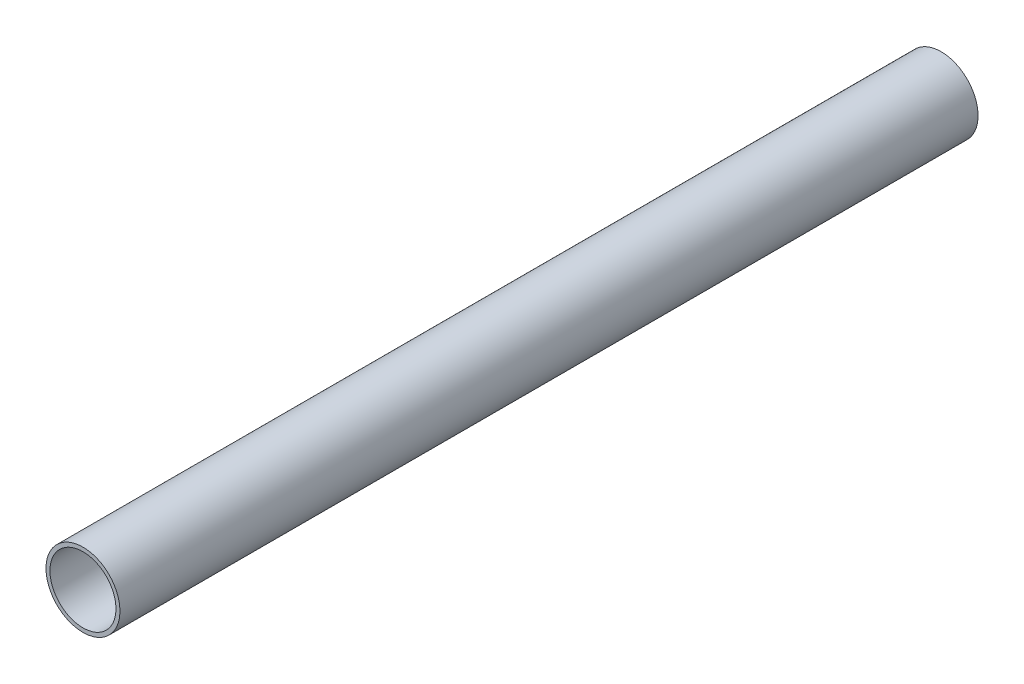
ISO-10303-21;
HEADER;
FILE_DESCRIPTION(('STEP AP214'),'2;1');
FILE_NAME('part.step','',(''),(''),'','','');
FILE_SCHEMA(('AUTOMOTIVE_DESIGN { 1 0 10303 214 1 1 1 1 }'));
ENDSEC;
DATA;
#1=APPLICATION_CONTEXT('core data for automotive mechanical design processes');
#2=APPLICATION_PROTOCOL_DEFINITION('international standard','automotive_design',2000,#1);
#3=PRODUCT_CONTEXT('',#1,'mechanical');
#4=PRODUCT('Part','Part','',(#3));
#5=PRODUCT_RELATED_PRODUCT_CATEGORY('part','',(#4));
#6=PRODUCT_DEFINITION_FORMATION('','',#4);
#7=PRODUCT_DEFINITION_CONTEXT('part definition',#1,'design');
#8=PRODUCT_DEFINITION('design','',#6,#7);
#9=PRODUCT_DEFINITION_SHAPE('','',#8);
#10=(LENGTH_UNIT() NAMED_UNIT(*) SI_UNIT(.MILLI.,.METRE.));
#11=(NAMED_UNIT(*) PLANE_ANGLE_UNIT() SI_UNIT($,.RADIAN.));
#12=(NAMED_UNIT(*) SI_UNIT($,.STERADIAN.) SOLID_ANGLE_UNIT());
#13=UNCERTAINTY_MEASURE_WITH_UNIT(LENGTH_MEASURE(1.E-05),#10,'distance_accuracy_value','');
#14=(GEOMETRIC_REPRESENTATION_CONTEXT(3) GLOBAL_UNCERTAINTY_ASSIGNED_CONTEXT((#13)) GLOBAL_UNIT_ASSIGNED_CONTEXT((#10,
#11,#12)) REPRESENTATION_CONTEXT('',''));
#15=CARTESIAN_POINT('',(0.,0.,0.));
#16=DIRECTION('',(0.,0.,1.));
#17=DIRECTION('',(1.,0.,0.));
#18=AXIS2_PLACEMENT_3D('',#15,#16,#17);
#19=CARTESIAN_POINT('',(0.,97.5,-400.));
#20=DIRECTION('',(0.,0.,-1.));
#21=DIRECTION('',(-1.,0.,0.));
#22=AXIS2_PLACEMENT_3D('',#19,#20,#21);
#23=PLANE('',#22);
#24=CARTESIAN_POINT('',(0.,97.5,-400.));
#25=DIRECTION('',(0.,0.,-1.));
#26=DIRECTION('',(-1.,0.,0.));
#27=AXIS2_PLACEMENT_3D('',#24,#25,#26);
#28=CIRCLE('',#27,14.);
#29=CARTESIAN_POINT('',(-14.,97.5,-400.));
#30=VERTEX_POINT('',#29);
#31=EDGE_CURVE('E10',#30,#30,#28,.T.);
#32=ORIENTED_EDGE('',*,*,#31,.T.);
#33=EDGE_LOOP('',(#32));
#34=FACE_BOUND('',#33,.T.);
#35=CARTESIAN_POINT('',(0.,97.5,-400.));
#36=DIRECTION('',(0.,0.,-1.));
#37=DIRECTION('',(-1.,0.,0.));
#38=AXIS2_PLACEMENT_3D('',#35,#36,#37);
#39=CIRCLE('',#38,12.5);
#40=CARTESIAN_POINT('',(-12.5,97.5,-400.));
#41=VERTEX_POINT('',#40);
#42=EDGE_CURVE('E42',#41,#41,#39,.T.);
#43=ORIENTED_EDGE('',*,*,#42,.F.);
#44=EDGE_LOOP('',(#43));
#45=FACE_BOUND('',#44,.T.);
#46=ADVANCED_FACE('F31',(#34,#45),#23,.T.);
#47=CARTESIAN_POINT('',(0.,97.5,-75.));
#48=DIRECTION('',(0.,0.,-1.));
#49=DIRECTION('',(-1.,0.,0.));
#50=AXIS2_PLACEMENT_3D('',#47,#48,#49);
#51=PLANE('',#50);
#52=CARTESIAN_POINT('',(0.,97.5,-75.));
#53=DIRECTION('',(0.,0.,-1.));
#54=DIRECTION('',(-1.,0.,0.));
#55=AXIS2_PLACEMENT_3D('',#52,#53,#54);
#56=CIRCLE('',#55,14.);
#57=CARTESIAN_POINT('',(-14.,97.5,-75.));
#58=VERTEX_POINT('',#57);
#59=EDGE_CURVE('E35',#58,#58,#56,.T.);
#60=ORIENTED_EDGE('',*,*,#59,.F.);
#61=EDGE_LOOP('',(#60));
#62=FACE_BOUND('',#61,.T.);
#63=CARTESIAN_POINT('',(0.,97.5,-75.));
#64=DIRECTION('',(0.,0.,-1.));
#65=DIRECTION('',(-1.,0.,0.));
#66=AXIS2_PLACEMENT_3D('',#63,#64,#65);
#67=CIRCLE('',#66,12.5);
#68=CARTESIAN_POINT('',(-12.5,97.5,-75.));
#69=VERTEX_POINT('',#68);
#70=EDGE_CURVE('E44',#69,#69,#67,.T.);
#71=ORIENTED_EDGE('',*,*,#70,.T.);
#72=EDGE_LOOP('',(#71));
#73=FACE_BOUND('',#72,.T.);
#74=ADVANCED_FACE('F54',(#62,#73),#51,.F.);
#75=CARTESIAN_POINT('',(0.,97.5,-400.));
#76=DIRECTION('',(0.,0.,1.));
#77=DIRECTION('',(1.,0.,0.));
#78=AXIS2_PLACEMENT_3D('',#75,#76,#77);
#79=CYLINDRICAL_SURFACE('',#78,14.);
#80=ORIENTED_EDGE('',*,*,#31,.F.);
#81=EDGE_LOOP('',(#80));
#82=FACE_BOUND('',#81,.T.);
#83=ORIENTED_EDGE('',*,*,#59,.T.);
#84=EDGE_LOOP('',(#83));
#85=FACE_BOUND('',#84,.T.);
#86=ADVANCED_FACE('F33',(#82,#85),#79,.T.);
#87=CARTESIAN_POINT('',(0.,97.5,-400.));
#88=DIRECTION('',(0.,0.,1.));
#89=DIRECTION('',(1.,0.,0.));
#90=AXIS2_PLACEMENT_3D('',#87,#88,#89);
#91=CYLINDRICAL_SURFACE('',#90,12.5);
#92=ORIENTED_EDGE('',*,*,#42,.T.);
#93=EDGE_LOOP('',(#92));
#94=FACE_BOUND('',#93,.T.);
#95=ORIENTED_EDGE('',*,*,#70,.F.);
#96=EDGE_LOOP('',(#95));
#97=FACE_BOUND('',#96,.T.);
#98=ADVANCED_FACE('F50',(#94,#97),#91,.F.);
#99=CLOSED_SHELL('',(#46,#74,#86,#98));
#100=MANIFOLD_SOLID_BREP('B2',#99);
#101=ADVANCED_BREP_SHAPE_REPRESENTATION('',(#18,#100),#14);
#102=SHAPE_DEFINITION_REPRESENTATION(#9,#101);
ENDSEC;
END-ISO-10303-21;
